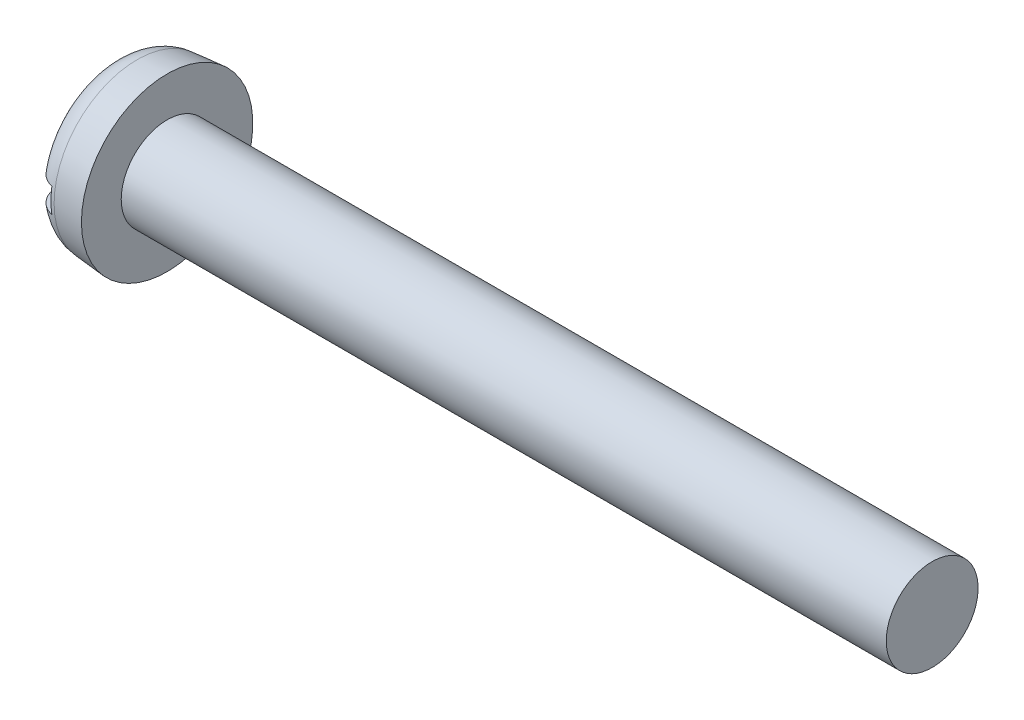
ISO-10303-21;
HEADER;
FILE_DESCRIPTION(('STEP AP214'),'2;1');
FILE_NAME('part.step','',(''),(''),'','','');
FILE_SCHEMA(('AUTOMOTIVE_DESIGN { 1 0 10303 214 1 1 1 1 }'));
ENDSEC;
DATA;
#1=APPLICATION_CONTEXT('core data for automotive mechanical design processes');
#2=APPLICATION_PROTOCOL_DEFINITION('international standard','automotive_design',2000,#1);
#3=PRODUCT_CONTEXT('',#1,'mechanical');
#4=PRODUCT('Part','Part','',(#3));
#5=PRODUCT_RELATED_PRODUCT_CATEGORY('part','',(#4));
#6=PRODUCT_DEFINITION_FORMATION('','',#4);
#7=PRODUCT_DEFINITION_CONTEXT('part definition',#1,'design');
#8=PRODUCT_DEFINITION('design','',#6,#7);
#9=PRODUCT_DEFINITION_SHAPE('','',#8);
#10=(LENGTH_UNIT() NAMED_UNIT(*) SI_UNIT(.MILLI.,.METRE.));
#11=(NAMED_UNIT(*) PLANE_ANGLE_UNIT() SI_UNIT($,.RADIAN.));
#12=(NAMED_UNIT(*) SI_UNIT($,.STERADIAN.) SOLID_ANGLE_UNIT());
#13=UNCERTAINTY_MEASURE_WITH_UNIT(LENGTH_MEASURE(1.E-05),#10,'distance_accuracy_value','');
#14=(GEOMETRIC_REPRESENTATION_CONTEXT(3) GLOBAL_UNCERTAINTY_ASSIGNED_CONTEXT((#13)) GLOBAL_UNIT_ASSIGNED_CONTEXT((#10,
#11,#12)) REPRESENTATION_CONTEXT('',''));
#15=CARTESIAN_POINT('',(0.,0.,0.));
#16=DIRECTION('',(0.,0.,1.));
#17=DIRECTION('',(1.,0.,0.));
#18=AXIS2_PLACEMENT_3D('',#15,#16,#17);
#19=CARTESIAN_POINT('',(0.,0.,0.));
#20=DIRECTION('',(-1.,0.,0.));
#21=DIRECTION('',(0.,0.,1.));
#22=AXIS2_PLACEMENT_3D('',#19,#20,#21);
#23=PLANE('',#22);
#24=DIRECTION('',(0.,0.,-1.));
#25=VECTOR('',#24,1.);
#26=CARTESIAN_POINT('',(0.,0.4,2.8));
#27=LINE('',#26,#25);
#28=CARTESIAN_POINT('',(0.,0.4,1.77326763142532));
#29=VERTEX_POINT('',#28);
#30=CARTESIAN_POINT('',(0.,0.4,-1.77326763142532));
#31=VERTEX_POINT('',#30);
#32=EDGE_CURVE('E88',#29,#31,#27,.T.);
#33=ORIENTED_EDGE('',*,*,#32,.F.);
#34=CARTESIAN_POINT('',(0.,0.,0.));
#35=DIRECTION('',(-1.,0.,0.));
#36=DIRECTION('',(0.,0.,1.));
#37=AXIS2_PLACEMENT_3D('',#34,#35,#36);
#38=CIRCLE('',#37,1.81782234903766);
#39=EDGE_CURVE('E94',#29,#31,#38,.T.);
#40=ORIENTED_EDGE('',*,*,#39,.T.);
#41=EDGE_LOOP('',(#33,#40));
#42=FACE_BOUND('',#41,.T.);
#43=ADVANCED_FACE('F35',(#42),#23,.T.);
#44=CARTESIAN_POINT('',(-25.4,0.,0.));
#45=DIRECTION('',(-1.,0.,0.));
#46=DIRECTION('',(0.,0.,1.));
#47=AXIS2_PLACEMENT_3D('',#44,#45,#46);
#48=CYLINDRICAL_SURFACE('',#47,1.5);
#49=CARTESIAN_POINT('',(26.8,0.,0.));
#50=DIRECTION('',(-1.,0.,0.));
#51=DIRECTION('',(0.,0.,1.));
#52=AXIS2_PLACEMENT_3D('',#49,#50,#51);
#53=CIRCLE('',#52,1.5);
#54=CARTESIAN_POINT('',(26.8,0.,1.5));
#55=VERTEX_POINT('',#54);
#56=EDGE_CURVE('E95',#55,#55,#53,.T.);
#57=ORIENTED_EDGE('',*,*,#56,.T.);
#58=EDGE_LOOP('',(#57));
#59=FACE_BOUND('',#58,.T.);
#60=CARTESIAN_POINT('',(1.8,0.,0.));
#61=DIRECTION('',(-1.,0.,0.));
#62=DIRECTION('',(0.,0.,1.));
#63=AXIS2_PLACEMENT_3D('',#60,#61,#62);
#64=CIRCLE('',#63,1.5);
#65=CARTESIAN_POINT('',(1.8,0.,1.5));
#66=VERTEX_POINT('',#65);
#67=EDGE_CURVE('E152',#66,#66,#64,.T.);
#68=ORIENTED_EDGE('',*,*,#67,.F.);
#69=EDGE_LOOP('',(#68));
#70=FACE_BOUND('',#69,.T.);
#71=ADVANCED_FACE('F140',(#59,#70),#48,.T.);
#72=CARTESIAN_POINT('',(26.8,1.5,0.));
#73=DIRECTION('',(1.,0.,0.));
#74=DIRECTION('',(0.,0.,-1.));
#75=AXIS2_PLACEMENT_3D('',#72,#73,#74);
#76=PLANE('',#75);
#77=ORIENTED_EDGE('',*,*,#56,.F.);
#78=EDGE_LOOP('',(#77));
#79=FACE_BOUND('',#78,.T.);
#80=ADVANCED_FACE('F138',(#79),#76,.T.);
#81=DIRECTION('',(0.,0.,1.));
#82=VECTOR('',#81,1.);
#83=CARTESIAN_POINT('',(0.,-0.4,-2.8));
#84=LINE('',#83,#82);
#85=CARTESIAN_POINT('',(0.,-0.4,-1.77326763142532));
#86=VERTEX_POINT('',#85);
#87=CARTESIAN_POINT('',(0.,-0.4,1.77326763142532));
#88=VERTEX_POINT('',#87);
#89=EDGE_CURVE('E79',#86,#88,#84,.T.);
#90=ORIENTED_EDGE('',*,*,#89,.F.);
#91=EDGE_CURVE('E86',#86,#88,#38,.T.);
#92=ORIENTED_EDGE('',*,*,#91,.T.);
#93=EDGE_LOOP('',(#90,#92));
#94=FACE_BOUND('',#93,.T.);
#95=ADVANCED_FACE('F85',(#94),#23,.T.);
#96=CARTESIAN_POINT('',(0.,0.,0.));
#97=DIRECTION('',(1.,0.,0.));
#98=DIRECTION('',(0.,0.,-1.));
#99=AXIS2_PLACEMENT_3D('',#96,#97,#98);
#100=CONICAL_SURFACE('',#99,2.64252040565334,0.0872664625997168);
#101=CARTESIAN_POINT('',(0.821559831527111,0.,0.));
#102=DIRECTION('',(-1.,0.,0.));
#103=DIRECTION('',(0.,0.,1.));
#104=AXIS2_PLACEMENT_3D('',#101,#102,#103);
#105=CIRCLE('',#104,2.71439757732023);
#106=CARTESIAN_POINT('',(0.821559831527111,0.,2.71439757732023));
#107=VERTEX_POINT('',#106);
#108=EDGE_CURVE('E98',#107,#107,#105,.F.);
#109=ORIENTED_EDGE('',*,*,#108,.T.);
#110=EDGE_LOOP('',(#109));
#111=FACE_BOUND('',#110,.T.);
#112=CARTESIAN_POINT('',(1.8,0.,0.));
#113=DIRECTION('',(-1.,0.,0.));
#114=DIRECTION('',(0.,0.,1.));
#115=AXIS2_PLACEMENT_3D('',#112,#113,#114);
#116=CIRCLE('',#115,2.8);
#117=CARTESIAN_POINT('',(1.8,0.,2.8));
#118=VERTEX_POINT('',#117);
#119=EDGE_CURVE('E100',#118,#118,#116,.T.);
#120=ORIENTED_EDGE('',*,*,#119,.T.);
#121=EDGE_LOOP('',(#120));
#122=FACE_BOUND('',#121,.T.);
#123=ADVANCED_FACE('F131',(#111,#122),#100,.T.);
#124=CARTESIAN_POINT('',(1.8,1.5,0.));
#125=DIRECTION('',(-1.,0.,0.));
#126=DIRECTION('',(0.,0.,1.));
#127=AXIS2_PLACEMENT_3D('',#124,#125,#126);
#128=PLANE('',#127);
#129=ORIENTED_EDGE('',*,*,#119,.F.);
#130=EDGE_LOOP('',(#129));
#131=FACE_BOUND('',#130,.T.);
#132=ORIENTED_EDGE('',*,*,#67,.T.);
#133=EDGE_LOOP('',(#132));
#134=FACE_BOUND('',#133,.T.);
#135=ADVANCED_FACE('F127',(#131,#134),#128,.F.);
#136=CARTESIAN_POINT('',(0.9,0.,0.));
#137=DIRECTION('',(-1.,0.,0.));
#138=DIRECTION('',(0.,0.,1.));
#139=AXIS2_PLACEMENT_3D('',#136,#137,#138);
#140=TOROIDAL_SURFACE('',#139,1.81782234903766,0.9);
#141=CARTESIAN_POINT('',(0.285780762477817,0.4,-2.44311963508101));
#142=CARTESIAN_POINT('',(0.322325244969282,0.4,-2.47769297217772));
#143=CARTESIAN_POINT('',(0.361794878156767,0.4,-2.50922544126929));
#144=CARTESIAN_POINT('',(0.445493757535043,0.4,-2.56525291577746));
#145=CARTESIAN_POINT('',(0.48972822484029,0.4,-2.58974009118149));
#146=CARTESIAN_POINT('',(0.581685294636184,0.4,-2.63091846199156));
#147=CARTESIAN_POINT('',(0.629407305379898,0.4,-2.64761097641683));
#148=CARTESIAN_POINT('',(0.726972312257169,0.4,-2.67270033258514));
#149=CARTESIAN_POINT('',(0.776814803129367,0.4,-2.68109913910669));
#150=CARTESIAN_POINT('',(0.876977038697279,0.4,-2.68933922206438));
#151=CARTESIAN_POINT('',(0.92729364560996,0.4,-2.68921866149007));
#152=CARTESIAN_POINT('',(1.02719093347253,0.4,-2.68051830929739));
#153=CARTESIAN_POINT('',(1.07677160162593,0.4,-2.67193837076201));
#154=CARTESIAN_POINT('',(1.17371760664879,0.4,-2.6465919807109));
#155=CARTESIAN_POINT('',(1.2210859954371,0.4,-2.62983719558013));
#156=CARTESIAN_POINT('',(1.31235127069059,0.4,-2.58864040768255));
#157=CARTESIAN_POINT('',(1.35624813968071,0.4,-2.56419836622246));
#158=CARTESIAN_POINT('',(1.43950339303332,0.4,-2.50824069345436));
#159=CARTESIAN_POINT('',(1.47884484993389,0.4,-2.47669988555644));
#160=CARTESIAN_POINT('',(1.55173067508121,0.4,-2.40751412200212));
#161=CARTESIAN_POINT('',(1.5852748745774,0.4,-2.36986898871862));
#162=CARTESIAN_POINT('',(1.64594872274809,0.4,-2.28919528368316));
#163=CARTESIAN_POINT('',(1.67301846569636,0.4,-2.24612167422176));
#164=CARTESIAN_POINT('',(1.71966197411636,0.4,-2.15609376898817));
#165=CARTESIAN_POINT('',(1.73923530584546,0.4,-2.10913924885738));
#166=CARTESIAN_POINT('',(1.77066025907209,0.4,-2.01194193646076));
#167=CARTESIAN_POINT('',(1.78239254664628,0.4,-1.96166058810882));
#168=CARTESIAN_POINT('',(1.7974373595853,0.4,-1.85985639013623));
#169=CARTESIAN_POINT('',(1.80074908437145,0.4,-1.80833342293966));
#170=CARTESIAN_POINT('',(1.79894832980293,0.4,-1.70434405475568));
#171=CARTESIAN_POINT('',(1.79365584590562,0.4,-1.651880798299));
#172=CARTESIAN_POINT('',(1.77456092354076,0.4,-1.54852841034414));
#173=CARTESIAN_POINT('',(1.76075741543224,0.4,-1.49763947754675));
#174=CARTESIAN_POINT('',(1.7246504916629,0.4,-1.3975266769579));
#175=CARTESIAN_POINT('',(1.70214283236717,0.4,-1.34837644263265));
#176=CARTESIAN_POINT('',(1.64933120824444,0.4,-1.25444995564252));
#177=CARTESIAN_POINT('',(1.6190255468442,0.4,-1.20967465773975));
#178=CARTESIAN_POINT('',(1.55085214424215,0.4,-1.12504927254803));
#179=CARTESIAN_POINT('',(1.51286662510254,0.4,-1.08529386793689));
#180=CARTESIAN_POINT('',(1.4306134165613,0.4,-1.01288372669284));
#181=CARTESIAN_POINT('',(1.38634513970435,0.4,-0.98022965477811));
#182=CARTESIAN_POINT('',(1.29378824575784,0.4,-0.924048107397016));
#183=CARTESIAN_POINT('',(1.24562231583718,0.4,-0.900319541839471));
#184=CARTESIAN_POINT('',(1.14574424072186,0.4,-0.862177327128565));
#185=CARTESIAN_POINT('',(1.09403573066562,0.4,-0.847754283110134));
#186=CARTESIAN_POINT('',(0.993395643106033,0.4,-0.830011922353258));
#187=CARTESIAN_POINT('',(0.944615271160061,0.4,-0.825833796085956));
#188=CARTESIAN_POINT('',(0.847107354416665,0.4,-0.826334878356685));
#189=CARTESIAN_POINT('',(0.798379798268946,0.4,-0.831011470142969));
#190=CARTESIAN_POINT('',(0.705495670608722,0.4,-0.848340731069384));
#191=CARTESIAN_POINT('',(0.661242330843084,0.4,-0.860484898174224));
#192=CARTESIAN_POINT('',(0.575232402842407,0.4,-0.891650416332973));
#193=CARTESIAN_POINT('',(0.53347652813922,0.4,-0.910673721938904));
#194=CARTESIAN_POINT('',(0.451191926076944,0.4,-0.956010770911779));
#195=CARTESIAN_POINT('',(0.41084895856706,0.4,-0.982660648611481));
#196=CARTESIAN_POINT('',(0.334722321142851,0.4,-1.04182188589593));
#197=CARTESIAN_POINT('',(0.298940164912517,0.4,-1.0743351828853));
#198=CARTESIAN_POINT('',(0.229649980616187,0.4,-1.14749226888793));
#199=CARTESIAN_POINT('',(0.196634914830279,0.4,-1.18860403936715));
#200=CARTESIAN_POINT('',(0.137645150810002,0.4,-1.27560624817727));
#201=CARTESIAN_POINT('',(0.111672172806045,0.4,-1.32149785033543));
#202=CARTESIAN_POINT('',(0.0665593590158842,0.4,-1.41881690272049));
#203=CARTESIAN_POINT('',(0.0477401615322292,0.4,-1.47039354331754));
#204=CARTESIAN_POINT('',(0.0191028447664946,0.4,-1.57598967955257));
#205=CARTESIAN_POINT('',(0.00928429911433809,0.4,-1.63000905934828));
#206=CARTESIAN_POINT('',(-0.000908845669418395,0.4,-1.73850050809585));
#207=CARTESIAN_POINT('',(-0.00135843890630447,0.4,-1.7929654882335));
#208=CARTESIAN_POINT('',(0.0071379486879365,0.4,-1.90117587148683));
#209=CARTESIAN_POINT('',(0.0160852351491476,0.4,-1.9549211735574));
#210=CARTESIAN_POINT('',(0.0428869469078852,0.4,-2.05874477252473));
#211=CARTESIAN_POINT('',(0.0605196216319731,0.4,-2.10888044427302));
#212=CARTESIAN_POINT('',(0.104140493725079,0.4,-2.20532358851202));
#213=CARTESIAN_POINT('',(0.130117020588857,0.4,-2.25163629510255));
#214=CARTESIAN_POINT('',(0.178150945787742,0.4,-2.32211375046635));
#215=CARTESIAN_POINT('',(0.197843641859489,0.4,-2.34792122195273));
#216=CARTESIAN_POINT('',(0.239879292580621,0.4,-2.39728022756983));
#217=CARTESIAN_POINT('',(0.26222221206527,0.4,-2.42083179162577));
#218=CARTESIAN_POINT('',(0.285780762477817,0.4,-2.44311963508101));
#219=B_SPLINE_CURVE_WITH_KNOTS('',3,(#141,#142,#143,#144,#145,#146,#147,#148,#149,#150,#151,
#152,#153,#154,#155,#156,#157,#158,#159,#160,#161,#162,#163,#164,#165,#166,#167,#168,#169,#170,
#171,#172,#173,#174,#175,#176,#177,#178,#179,#180,#181,#182,#183,#184,#185,#186,#187,#188,#189,
#190,#191,#192,#193,#194,#195,#196,#197,#198,#199,#200,#201,#202,#203,#204,#205,#206,#207,#208,
#209,#210,#211,#212,#213,#214,#215,#216,#217,#218),.UNSPECIFIED.,.T.,.F.,(4,2,2,2,2,2,2,2,2,2,2,
2,2,2,2,2,2,2,2,2,2,2,2,2,2,2,2,2,2,2,2,2,2,2,2,2,2,2,4),(0.,0.150804282209429,
0.301775523831159,0.452721208703323,0.603631125974155,0.753865076726384,0.904101636690626,
1.05412441728995,1.2041479530309,1.35471219197995,1.50528081291864,1.65719291262943,
1.80911380065295,1.96329712022902,2.11749509812026,2.27496068670365,2.43244606914274,
2.59387611122166,2.75534130458713,2.9195015653164,3.08367718561128,3.24389389244898,
3.40394859014677,3.55004213794101,3.69609251881817,3.83315592967566,3.97025831464732,
4.11470991133513,4.25920932580005,4.41668805635775,4.57420522099046,4.73812462607052,
4.90203626571949,5.06463536051201,5.22725705028985,5.38592661841767,5.54437521558828,
5.64159310397338,5.73880970255809),.UNSPECIFIED.);
#220=CARTESIAN_POINT('',(0.7,0.4,-2.66547244738019));
#221=VERTEX_POINT('',#220);
#222=EDGE_CURVE('E11',#31,#221,#219,.T.);
#223=ORIENTED_EDGE('',*,*,#222,.F.);
#224=ORIENTED_EDGE('',*,*,#39,.F.);
#225=CARTESIAN_POINT('',(0.356169071138295,0.4,1.02545886384317));
#226=CARTESIAN_POINT('',(0.394477383289829,0.4,0.994276095963573));
#227=CARTESIAN_POINT('',(0.435252098816795,0.4,0.966090537778846));
#228=CARTESIAN_POINT('',(0.520874070068605,0.4,0.916713010685472));
#229=CARTESIAN_POINT('',(0.565722974989389,0.4,0.895523890103121));
#230=CARTESIAN_POINT('',(0.658585145836014,0.4,0.861072215462474));
#231=CARTESIAN_POINT('',(0.706609437889925,0.4,0.84783908573147));
#232=CARTESIAN_POINT('',(0.804243253507339,0.4,0.83024223356215));
#233=CARTESIAN_POINT('',(0.853851628876229,0.4,0.825872228699233));
#234=CARTESIAN_POINT('',(0.950010182321422,0.4,0.826277197704913));
#235=CARTESIAN_POINT('',(0.996563474122619,0.4,0.830513937244102));
#236=CARTESIAN_POINT('',(1.08828168676608,0.4,0.846797595491544));
#237=CARTESIAN_POINT('',(1.1334463088223,0.4,0.858846182848628));
#238=CARTESIAN_POINT('',(1.22099947575276,0.4,0.890027753500388));
#239=CARTESIAN_POINT('',(1.26339999097867,0.4,0.909127417221131));
#240=CARTESIAN_POINT('',(1.34475562295769,0.4,0.953613660794996));
#241=CARTESIAN_POINT('',(1.38370973618203,0.4,0.979002063689565));
#242=CARTESIAN_POINT('',(1.4606297229717,0.4,1.03768873851847));
#243=CARTESIAN_POINT('',(1.49821861120609,0.4,1.07148126912977));
#244=CARTESIAN_POINT('',(1.56766557552966,0.4,1.14451739265722));
#245=CARTESIAN_POINT('',(1.59952174981566,0.4,1.18376278691406));
#246=CARTESIAN_POINT('',(1.65882951195037,0.4,1.26965174466254));
#247=CARTESIAN_POINT('',(1.68580874421987,0.4,1.3166225459502));
#248=CARTESIAN_POINT('',(1.7316261790846,0.4,1.41438438512647));
#249=CARTESIAN_POINT('',(1.7504634598458,0.4,1.46517585482832));
#250=CARTESIAN_POINT('',(1.77959171793735,0.4,1.56990546726));
#251=CARTESIAN_POINT('',(1.78976336496765,0.4,1.62387693551388));
#252=CARTESIAN_POINT('',(1.80070617985939,0.4,1.73276786407042));
#253=CARTESIAN_POINT('',(1.80147810121521,0.4,1.78768724803349));
#254=CARTESIAN_POINT('',(1.7935515731225,0.4,1.89576039323533));
#255=CARTESIAN_POINT('',(1.78503812714098,0.4,1.94892767588158));
#256=CARTESIAN_POINT('',(1.75897009134329,0.4,2.05299963181348));
#257=CARTESIAN_POINT('',(1.74141670948687,0.4,2.10390460641263));
#258=CARTESIAN_POINT('',(1.69825810143573,0.4,2.20064023444731));
#259=CARTESIAN_POINT('',(1.67286703477487,0.4,2.24656646381803));
#260=CARTESIAN_POINT('',(1.61458416704904,0.4,2.33338474929434));
#261=CARTESIAN_POINT('',(1.58169323312494,0.4,2.37427738654701));
#262=CARTESIAN_POINT('',(1.51007060998367,0.4,2.44900649357427));
#263=CARTESIAN_POINT('',(1.47146964140907,0.4,2.48296829636122));
#264=CARTESIAN_POINT('',(1.38904817001727,0.4,2.54382334084698));
#265=CARTESIAN_POINT('',(1.34522808158393,0.4,2.57071714318276));
#266=CARTESIAN_POINT('',(1.25424836231413,0.4,2.61630908807752));
#267=CARTESIAN_POINT('',(1.20714119293126,0.4,2.63511196373395));
#268=CARTESIAN_POINT('',(1.11042474691739,0.4,2.66447616047847));
#269=CARTESIAN_POINT('',(1.06081558875378,0.4,2.67503787139057));
#270=CARTESIAN_POINT('',(0.960893961973374,0.4,2.68755622717405));
#271=CARTESIAN_POINT('',(0.910589316471373,0.4,2.68957539390776));
#272=CARTESIAN_POINT('',(0.810358152757914,0.4,2.68512046084422));
#273=CARTESIAN_POINT('',(0.760431626986744,0.4,2.67864653130185));
#274=CARTESIAN_POINT('',(0.662478823238217,0.4,2.65741995217084));
#275=CARTESIAN_POINT('',(0.614448868329621,0.4,2.64268425826029));
#276=CARTESIAN_POINT('',(0.521534433162197,0.4,2.60538142887937));
#277=CARTESIAN_POINT('',(0.476649962619439,0.4,2.58281426921971));
#278=CARTESIAN_POINT('',(0.391148993047609,0.4,2.53043182461717));
#279=CARTESIAN_POINT('',(0.350545548527357,0.4,2.50059523892845));
#280=CARTESIAN_POINT('',(0.274874117650141,0.4,2.43457977439371));
#281=CARTESIAN_POINT('',(0.239806285839746,0.4,2.39840071853429));
#282=CARTESIAN_POINT('',(0.175879279186199,0.4,2.32042102737606));
#283=CARTESIAN_POINT('',(0.147073507775005,0.4,2.27857662814835));
#284=CARTESIAN_POINT('',(0.0967847753411474,0.4,2.19069995841567));
#285=CARTESIAN_POINT('',(0.07530224160311,0.4,2.14466744374764));
#286=CARTESIAN_POINT('',(0.0399276675747797,0.4,2.04903409979779));
#287=CARTESIAN_POINT('',(0.0261471165350434,0.4,1.99939205575588));
#288=CARTESIAN_POINT('',(0.00693602242391574,0.4,1.89852251200784));
#289=CARTESIAN_POINT('',(0.00150590448368233,0.4,1.84729493171548));
#290=CARTESIAN_POINT('',(-0.000985777473937043,0.4,1.74359522844075));
#291=CARTESIAN_POINT('',(0.00212519999965263,0.4,1.69111899279254));
#292=CARTESIAN_POINT('',(0.0168916821616578,0.4,1.58737297380086));
#293=CARTESIAN_POINT('',(0.0285499964789277,0.4,1.53610359288829));
#294=CARTESIAN_POINT('',(0.0604020950384818,0.4,1.43486374575567));
#295=CARTESIAN_POINT('',(0.0808043159051547,0.4,1.38495893538538));
#296=CARTESIAN_POINT('',(0.129530825890043,0.4,1.28921347783136));
#297=CARTESIAN_POINT('',(0.157849403934622,0.4,1.24336993202389));
#298=CARTESIAN_POINT('',(0.213684916145749,0.4,1.16773658539622));
#299=CARTESIAN_POINT('',(0.239651023875377,0.4,1.13678903007943));
#300=CARTESIAN_POINT('',(0.29525297901351,0.4,1.07838116842152));
#301=CARTESIAN_POINT('',(0.324888803246328,0.4,1.05092084005941));
#302=CARTESIAN_POINT('',(0.356169071138295,0.4,1.02545886384317));
#303=B_SPLINE_CURVE_WITH_KNOTS('',3,(#225,#226,#227,#228,#229,#230,#231,#232,#233,#234,#235,
#236,#237,#238,#239,#240,#241,#242,#243,#244,#245,#246,#247,#248,#249,#250,#251,#252,#253,#254,
#255,#256,#257,#258,#259,#260,#261,#262,#263,#264,#265,#266,#267,#268,#269,#270,#271,#272,#273,
#274,#275,#276,#277,#278,#279,#280,#281,#282,#283,#284,#285,#286,#287,#288,#289,#290,#291,#292,
#293,#294,#295,#296,#297,#298,#299,#300,#301,#302),.UNSPECIFIED.,.T.,.F.,(4,2,2,2,2,2,2,2,2,2,2,
2,2,2,2,2,2,2,2,2,2,2,2,2,2,2,2,2,2,2,2,2,2,2,2,2,2,2,4),(0.,0.148056677712979,
0.296173556814866,0.444834912477076,0.593390856036848,0.732942639414739,0.87252424155987,
1.01145452751666,1.15042513517956,1.30141738715291,1.45245963818336,1.61420969223844,
1.7759780548859,1.93993961693164,2.10388803551639,2.26462860972824,2.42534771058163,
2.5820147845557,2.73866375372932,2.89216335268838,3.04565077231286,3.19708679229202,
3.34851564860216,3.49883427697698,3.64914989207022,3.79915813668078,3.94916684463061,
4.09962050651671,4.25007836811616,4.40177296660437,4.55347641441351,4.70732244078731,
4.86117629939849,5.0181609530014,5.17519723279955,5.33620557401864,5.49709805791682,
5.61799301592463,5.73888721047272),.UNSPECIFIED.);
#304=CARTESIAN_POINT('',(0.7,0.4,2.66547244738019));
#305=VERTEX_POINT('',#304);
#306=EDGE_CURVE('E112',#305,#29,#303,.T.);
#307=ORIENTED_EDGE('',*,*,#306,.F.);
#308=CARTESIAN_POINT('',(0.7,0.,0.));
#309=DIRECTION('',(-1.,0.,0.));
#310=DIRECTION('',(0.,0.,1.));
#311=AXIS2_PLACEMENT_3D('',#308,#309,#310);
#312=CIRCLE('',#311,2.69531878777687);
#313=CARTESIAN_POINT('',(0.7,-0.4,2.66547244738019));
#314=VERTEX_POINT('',#313);
#315=EDGE_CURVE('E106',#305,#314,#312,.F.);
#316=ORIENTED_EDGE('',*,*,#315,.T.);
#317=CARTESIAN_POINT('',(0.356169071138295,-0.4,1.02545886384317));
#318=CARTESIAN_POINT('',(0.314031332279046,-0.4,1.05976167261355));
#319=CARTESIAN_POINT('',(0.274819372687131,-0.4,1.0977427449374));
#320=CARTESIAN_POINT('',(0.20326819432942,-0.4,1.17978565669674));
#321=CARTESIAN_POINT('',(0.170942545508555,-0.4,1.22385922524595));
#322=CARTESIAN_POINT('',(0.114111407238762,-0.4,1.31672727393884));
#323=CARTESIAN_POINT('',(0.0895968760226377,-0.4,1.36551620987613));
#324=CARTESIAN_POINT('',(0.0490785202121341,-0.4,1.46648183341045));
#325=CARTESIAN_POINT('',(0.0330703604686472,-0.4,1.51865678013273));
#326=CARTESIAN_POINT('',(0.0100453697545741,-0.4,1.62518908376032));
#327=CARTESIAN_POINT('',(0.00306618218707067,-0.4,1.67955460937645));
#328=CARTESIAN_POINT('',(-0.00144685561490171,-0.4,1.78868546318226));
#329=CARTESIAN_POINT('',(0.00101939609011308,-0.4,1.84345079568049));
#330=CARTESIAN_POINT('',(0.0152891480749748,-0.4,1.95052330416009));
#331=CARTESIAN_POINT('',(0.0268854930795697,-0.4,2.0028580557661));
#332=CARTESIAN_POINT('',(0.0589248901673074,-0.4,2.10474672243029));
#333=CARTESIAN_POINT('',(0.0793666318053631,-0.4,2.15430104818042));
#334=CARTESIAN_POINT('',(0.12795627217374,-0.4,2.24792186385266));
#335=CARTESIAN_POINT('',(0.155901237504733,-0.4,2.29209371256844));
#336=CARTESIAN_POINT('',(0.218944857951455,-0.4,2.37499861286517));
#337=CARTESIAN_POINT('',(0.254042725445853,-0.4,2.41373226246544));
#338=CARTESIAN_POINT('',(0.32966685096813,-0.4,2.48389534278566));
#339=CARTESIAN_POINT('',(0.370077637452011,-0.4,2.51544927894014));
#340=CARTESIAN_POINT('',(0.455677448683675,-0.4,2.57122459505542));
#341=CARTESIAN_POINT('',(0.50086612816506,-0.4,2.59544650436481));
#342=CARTESIAN_POINT('',(0.59413782417454,-0.4,2.6355729416184));
#343=CARTESIAN_POINT('',(0.642178527071037,-0.4,2.65157587103637));
#344=CARTESIAN_POINT('',(0.740273420359946,-0.4,2.67523109383666));
#345=CARTESIAN_POINT('',(0.790327524333045,-0.4,2.68288374523438));
#346=CARTESIAN_POINT('',(0.890686133385993,-0.4,2.68958762962226));
#347=CARTESIAN_POINT('',(0.940986998851126,-0.4,2.68869347246838));
#348=CARTESIAN_POINT('',(1.04072178380744,-0.4,2.67846167879018));
#349=CARTESIAN_POINT('',(1.0901557170213,-0.4,2.66912417603886));
#350=CARTESIAN_POINT('',(1.18669599164727,-0.4,2.64229877559468));
#351=CARTESIAN_POINT('',(1.23380501833184,-0.4,2.6248205362643));
#352=CARTESIAN_POINT('',(1.32443528846507,-0.4,2.58223220159563));
#353=CARTESIAN_POINT('',(1.36795650500275,-0.4,2.5571220490195));
#354=CARTESIAN_POINT('',(1.45036421793263,-0.4,2.49989362614525));
#355=CARTESIAN_POINT('',(1.48923230512215,-0.4,2.46774885590998));
#356=CARTESIAN_POINT('',(1.56107927302393,-0.4,2.39744378923729));
#357=CARTESIAN_POINT('',(1.59405796507024,-0.4,2.35928330016087));
#358=CARTESIAN_POINT('',(1.65352847250663,-0.4,2.2776666814067));
#359=CARTESIAN_POINT('',(1.67995797143492,-0.4,2.23416516156708));
#360=CARTESIAN_POINT('',(1.72526137908633,-0.4,2.14339421504175));
#361=CARTESIAN_POINT('',(1.74413484906926,-0.4,2.09612456975119));
#362=CARTESIAN_POINT('',(1.77411508290512,-0.4,1.9983989612356));
#363=CARTESIAN_POINT('',(1.78509960932637,-0.4,1.9479055243096));
#364=CARTESIAN_POINT('',(1.79862667184961,-0.4,1.84580292273346));
#365=CARTESIAN_POINT('',(1.80116838107033,-0.4,1.79419364929756));
#366=CARTESIAN_POINT('',(1.79780993826834,-0.4,1.69014314952536));
#367=CARTESIAN_POINT('',(1.79172746900389,-0.4,1.63770783465182));
#368=CARTESIAN_POINT('',(1.77106806778027,-0.4,1.53454005861514));
#369=CARTESIAN_POINT('',(1.75649007103968,-0.4,1.48380781174802));
#370=CARTESIAN_POINT('',(1.7188487103298,-0.4,1.38413781596447));
#371=CARTESIAN_POINT('',(1.69558194660123,-0.4,1.33527684770509));
#372=CARTESIAN_POINT('',(1.64130257902653,-0.4,1.24205401456033));
#373=CARTESIAN_POINT('',(1.6102882125599,-0.4,1.19769317671197));
#374=CARTESIAN_POINT('',(1.54078360718032,-0.4,1.11407031283595));
#375=CARTESIAN_POINT('',(1.50218355419827,-0.4,1.07489936013486));
#376=CARTESIAN_POINT('',(1.41879382359701,-0.4,1.00377929202409));
#377=CARTESIAN_POINT('',(1.37400377230517,-0.4,0.971830612909673));
#378=CARTESIAN_POINT('',(1.28066227969846,-0.4,0.917245549760186));
#379=CARTESIAN_POINT('',(1.23224470963451,-0.4,0.894381439836964));
#380=CARTESIAN_POINT('',(1.13202516716603,-0.4,0.858023892867302));
#381=CARTESIAN_POINT('',(1.08022692076976,-0.4,0.844520323748755));
#382=CARTESIAN_POINT('',(0.979686768939646,-0.4,0.828554710074538));
#383=CARTESIAN_POINT('',(0.931083582720591,-0.4,0.82521631591368));
#384=CARTESIAN_POINT('',(0.834057576527118,-0.4,0.827306267768065));
#385=CARTESIAN_POINT('',(0.785634764475608,-0.4,0.832734994430688));
#386=CARTESIAN_POINT('',(0.693219129123408,-0.4,0.851440182721389));
#387=CARTESIAN_POINT('',(0.6491307615266,-0.4,0.864254528165209));
#388=CARTESIAN_POINT('',(0.563580966367806,-0.4,0.896690334746237));
#389=CARTESIAN_POINT('',(0.522117110679347,-0.4,0.916305391888431));
#390=CARTESIAN_POINT('',(0.460201335026829,-0.4,0.951554535089635));
#391=CARTESIAN_POINT('',(0.438547037771904,-0.4,0.965129512636782));
#392=CARTESIAN_POINT('',(0.396436028831446,-0.4,0.994018383793284));
#393=CARTESIAN_POINT('',(0.375979221006585,-0.4,1.00933213751562));
#394=CARTESIAN_POINT('',(0.356169071138295,-0.4,1.02545886384317));
#395=B_SPLINE_CURVE_WITH_KNOTS('',3,(#317,#318,#319,#320,#321,#322,#323,#324,#325,#326,#327,
#328,#329,#330,#331,#332,#333,#334,#335,#336,#337,#338,#339,#340,#341,#342,#343,#344,#345,#346,
#347,#348,#349,#350,#351,#352,#353,#354,#355,#356,#357,#358,#359,#360,#361,#362,#363,#364,#365,
#366,#367,#368,#369,#370,#371,#372,#373,#374,#375,#376,#377,#378,#379,#380,#381,#382,#383,#384,
#385,#386,#387,#388,#389,#390,#391,#392,#393,#394),.UNSPECIFIED.,.T.,.F.,(4,2,2,2,2,2,2,2,2,2,2,
2,2,2,2,2,2,2,2,2,2,2,2,2,2,2,2,2,2,2,2,2,2,2,2,2,2,2,4),(0.,0.162908543977832,
0.326135200101453,0.489172220791498,0.652126072139755,0.815757140806174,0.979389975458609,
1.13941349616251,1.29941331750199,1.45545894016543,1.61148738958683,1.76455910424509,
1.91761976498379,2.068802492645,2.21997873814259,2.37018969158947,2.52039826519579,
2.67042907998157,2.82046101999671,2.97106818075077,3.12168016531919,3.27367450756494,
3.42567767407005,3.5799880622519,3.73431356299688,3.89195060675763,4.04960741210517,
4.2112132976058,4.37285598283535,4.5370386362033,4.70123120514444,4.86099956435944,
5.02059471531597,5.16597452097208,5.31136063884072,5.44850857150574,5.58552770590542,
5.66212180496716,5.73870974628516),.UNSPECIFIED.);
#396=EDGE_CURVE('E93',#88,#314,#395,.T.);
#397=ORIENTED_EDGE('',*,*,#396,.F.);
#398=ORIENTED_EDGE('',*,*,#91,.F.);
#399=CARTESIAN_POINT('',(0.285780762477817,-0.4,-2.44311963508101));
#400=CARTESIAN_POINT('',(0.248557143829482,-0.4,-2.4078972812164));
#401=CARTESIAN_POINT('',(0.21431245236119,-0.4,-2.3694650707352));
#402=CARTESIAN_POINT('',(0.152768043532584,-0.4,-2.28733938194963));
#403=CARTESIAN_POINT('',(0.125478130377416,-0.4,-2.24363860286105));
#404=CARTESIAN_POINT('',(0.0786257158649476,-0.4,-2.15234079857027));
#405=CARTESIAN_POINT('',(0.0590537929026404,-0.4,-2.10474861000723));
#406=CARTESIAN_POINT('',(0.0280650821156157,-0.4,-2.00700047851119));
#407=CARTESIAN_POINT('',(0.0166461813020745,-0.4,-1.95684520345737));
#408=CARTESIAN_POINT('',(0.00206923204411924,-0.4,-1.85464080389292));
#409=CARTESIAN_POINT('',(-0.000972085111053216,-0.4,-1.80257506295451));
#410=CARTESIAN_POINT('',(0.00151453147792929,-0.4,-1.69864852440772));
#411=CARTESIAN_POINT('',(0.00704382880236595,-0.4,-1.64678776072725));
#412=CARTESIAN_POINT('',(0.0266516864050342,-0.4,-1.5434240201059));
#413=CARTESIAN_POINT('',(0.0409314131746844,-0.4,-1.49195921679783));
#414=CARTESIAN_POINT('',(0.0777275151672627,-0.4,-1.39206285915813));
#415=CARTESIAN_POINT('',(0.100245079836245,-0.4,-1.34363174403842));
#416=CARTESIAN_POINT('',(0.153482972183088,-0.4,-1.2500005252344));
#417=CARTESIAN_POINT('',(0.184382352554496,-0.4,-1.20490211419648));
#418=CARTESIAN_POINT('',(0.253306595403157,-0.4,-1.12049761259773));
#419=CARTESIAN_POINT('',(0.291333458753369,-0.4,-1.08119315410127));
#420=CARTESIAN_POINT('',(0.373599819825438,-0.4,-1.00962170698056));
#421=CARTESIAN_POINT('',(0.417845144124488,-0.4,-0.977361391817105));
#422=CARTESIAN_POINT('',(0.511393224424661,-0.4,-0.921257408160295));
#423=CARTESIAN_POINT('',(0.560693424544353,-0.4,-0.897409512943095));
#424=CARTESIAN_POINT('',(0.659899494014213,-0.4,-0.86056620148907));
#425=CARTESIAN_POINT('',(0.70959665550847,-0.4,-0.847011806093055));
#426=CARTESIAN_POINT('',(0.81063175641273,-0.4,-0.829407026781007));
#427=CARTESIAN_POINT('',(0.861968199741098,-0.4,-0.825348214635538));
#428=CARTESIAN_POINT('',(0.959752077480286,-0.4,-0.82693832731787));
#429=CARTESIAN_POINT('',(1.00621575887746,-0.4,-0.831730406017744));
#430=CARTESIAN_POINT('',(1.09766854953413,-0.4,-0.849077179323799));
#431=CARTESIAN_POINT('',(1.14265739171951,-0.4,-0.861633271803835));
#432=CARTESIAN_POINT('',(1.2299114176728,-0.4,-0.893807868219966));
#433=CARTESIAN_POINT('',(1.27218175788193,-0.4,-0.913412506998421));
#434=CARTESIAN_POINT('',(1.35320643219735,-0.4,-0.958874855551496));
#435=CARTESIAN_POINT('',(1.39195973961517,-0.4,-0.984734383223624));
#436=CARTESIAN_POINT('',(1.46843970297676,-0.4,-1.04440221898529));
#437=CARTESIAN_POINT('',(1.5057776319984,-0.4,-1.07870901508261));
#438=CARTESIAN_POINT('',(1.57463408911242,-0.4,-1.15273784634507));
#439=CARTESIAN_POINT('',(1.60615068897795,-0.4,-1.19246166827117));
#440=CARTESIAN_POINT('',(1.66460952025841,-0.4,-1.27921419766999));
#441=CARTESIAN_POINT('',(1.69108592858502,-0.4,-1.32655784594953));
#442=CARTESIAN_POINT('',(1.73582713929311,-0.4,-1.42498260596115));
#443=CARTESIAN_POINT('',(1.75409110005355,-0.4,-1.47606410012852));
#444=CARTESIAN_POINT('',(1.7819800651308,-0.4,-1.58118959955467));
#445=CARTESIAN_POINT('',(1.79150042969761,-0.4,-1.63526148025197));
#446=CARTESIAN_POINT('',(1.80112725488866,-0.4,-1.74424014808114));
#447=CARTESIAN_POINT('',(1.80123449731023,-0.4,-1.79914686549765));
#448=CARTESIAN_POINT('',(1.79200090917881,-0.4,-1.90704889801334));
#449=CARTESIAN_POINT('',(1.78285023172313,-0.4,-1.96006044029451));
#450=CARTESIAN_POINT('',(1.75554489311913,-0.4,-2.06371351442585));
#451=CARTESIAN_POINT('',(1.73739144905737,-0.4,-2.11435536562275));
#452=CARTESIAN_POINT('',(1.69310212999213,-0.4,-2.21047686976185));
#453=CARTESIAN_POINT('',(1.66717834059447,-0.4,-2.25605427430112));
#454=CARTESIAN_POINT('',(1.60789945686383,-0.4,-2.34209023989538));
#455=CARTESIAN_POINT('',(1.57454519739076,-0.4,-2.38254937521993));
#456=CARTESIAN_POINT('',(1.50207992140168,-0.4,-2.45635864078367));
#457=CARTESIAN_POINT('',(1.46309647311969,-0.4,-2.48983406282631));
#458=CARTESIAN_POINT('',(1.37999946341266,-0.4,-2.54966020191344));
#459=CARTESIAN_POINT('',(1.33588629200968,-0.4,-2.57601146011503));
#460=CARTESIAN_POINT('',(1.24441048294309,-0.4,-2.6204920842224));
#461=CARTESIAN_POINT('',(1.19709806498187,-0.4,-2.63872477396665));
#462=CARTESIAN_POINT('',(1.10007286159794,-0.4,-2.66692299241135));
#463=CARTESIAN_POINT('',(1.05036028930681,-0.4,-2.67688925373976));
#464=CARTESIAN_POINT('',(0.950330778412724,-0.4,-2.68821568147498));
#465=CARTESIAN_POINT('',(0.900020830724849,-0.4,-2.68963769422185));
#466=CARTESIAN_POINT('',(0.799864722777445,-0.4,-2.68399705480249));
#467=CARTESIAN_POINT('',(0.750018680334321,-0.4,-2.67693230351107));
#468=CARTESIAN_POINT('',(0.652295079642407,-0.4,-2.6545442288954));
#469=CARTESIAN_POINT('',(0.604414938079601,-0.4,-2.63923214293824));
#470=CARTESIAN_POINT('',(0.511939743577346,-0.4,-2.60081753553039));
#471=CARTESIAN_POINT('',(0.467340561615687,-0.4,-2.5777250172516));
#472=CARTESIAN_POINT('',(0.400101785238431,-0.4,-2.53543999984867));
#473=CARTESIAN_POINT('',(0.375979970292489,-0.4,-2.51855507086787));
#474=CARTESIAN_POINT('',(0.329505055171142,-0.4,-2.48250598020391));
#475=CARTESIAN_POINT('',(0.307151944649364,-0.4,-2.46334183185513));
#476=CARTESIAN_POINT('',(0.285780762477817,-0.4,-2.44311963508101));
#477=B_SPLINE_CURVE_WITH_KNOTS('',3,(#399,#400,#401,#402,#403,#404,#405,#406,#407,#408,#409,
#410,#411,#412,#413,#414,#415,#416,#417,#418,#419,#420,#421,#422,#423,#424,#425,#426,#427,#428,
#429,#430,#431,#432,#433,#434,#435,#436,#437,#438,#439,#440,#441,#442,#443,#444,#445,#446,#447,
#448,#449,#450,#451,#452,#453,#454,#455,#456,#457,#458,#459,#460,#461,#462,#463,#464,#465,#466,
#467,#468,#469,#470,#471,#472,#473,#474,#475,#476),.UNSPECIFIED.,.T.,.F.,(4,2,2,2,2,2,2,2,2,2,2,
2,2,2,2,2,2,2,2,2,2,2,2,2,2,2,2,2,2,2,2,2,2,2,2,2,2,2,4),(0.,0.153630076563003,0.30747554336492,
0.461132620212027,0.614749859849374,0.770496992161263,0.926268906303976,1.08576372212915,
1.24528157620828,1.40851960556979,1.57180352898442,1.73524147908282,1.89859719430262,
2.05228040591997,2.205827157294,2.34528036488284,2.48475868767391,2.62396413120245,
2.7632100815968,2.91467905032863,3.06619810123316,3.22817436288511,3.39016722026913,
3.55407439716564,3.71796796090444,3.87856222841603,4.03913479105936,4.19567175163465,
4.35219113316334,4.50560019509845,4.65899760068397,4.81038266514853,4.96175431138951,
5.1120289424741,5.26234075029904,5.41244826767269,5.56236352612232,5.65056762019062,
5.73877119825418),.UNSPECIFIED.);
#478=CARTESIAN_POINT('',(0.7,-0.4,-2.66547244738019));
#479=VERTEX_POINT('',#478);
#480=EDGE_CURVE('E47',#479,#86,#477,.T.);
#481=ORIENTED_EDGE('',*,*,#480,.F.);
#482=EDGE_CURVE('E59',#479,#221,#312,.F.);
#483=ORIENTED_EDGE('',*,*,#482,.T.);
#484=EDGE_LOOP('',(#223,#224,#307,#316,#397,#398,#481,#483));
#485=FACE_BOUND('',#484,.T.);
#486=ORIENTED_EDGE('',*,*,#108,.F.);
#487=EDGE_LOOP('',(#486));
#488=FACE_BOUND('',#487,.T.);
#489=ADVANCED_FACE('F37',(#485,#488),#140,.T.);
#490=CARTESIAN_POINT('',(0.7,0.4,2.8));
#491=DIRECTION('',(0.,1.,0.));
#492=DIRECTION('',(0.,0.,1.));
#493=AXIS2_PLACEMENT_3D('',#490,#491,#492);
#494=PLANE('',#493);
#495=ORIENTED_EDGE('',*,*,#222,.T.);
#496=DIRECTION('',(0.,0.,-1.));
#497=VECTOR('',#496,1.);
#498=CARTESIAN_POINT('',(0.7,0.4,2.8));
#499=LINE('',#498,#497);
#500=EDGE_CURVE('E87',#305,#221,#499,.T.);
#501=ORIENTED_EDGE('',*,*,#500,.F.);
#502=ORIENTED_EDGE('',*,*,#306,.T.);
#503=ORIENTED_EDGE('',*,*,#32,.T.);
#504=EDGE_LOOP('',(#495,#501,#502,#503));
#505=FACE_BOUND('',#504,.T.);
#506=ADVANCED_FACE('F119',(#505),#494,.F.);
#507=CARTESIAN_POINT('',(0.7,-0.4,-2.8));
#508=DIRECTION('',(0.,-1.,0.));
#509=DIRECTION('',(0.,0.,-1.));
#510=AXIS2_PLACEMENT_3D('',#507,#508,#509);
#511=PLANE('',#510);
#512=ORIENTED_EDGE('',*,*,#480,.T.);
#513=ORIENTED_EDGE('',*,*,#89,.T.);
#514=ORIENTED_EDGE('',*,*,#396,.T.);
#515=DIRECTION('',(0.,0.,1.));
#516=VECTOR('',#515,1.);
#517=CARTESIAN_POINT('',(0.7,-0.4,-2.8));
#518=LINE('',#517,#516);
#519=EDGE_CURVE('E54',#479,#314,#518,.T.);
#520=ORIENTED_EDGE('',*,*,#519,.F.);
#521=EDGE_LOOP('',(#512,#513,#514,#520));
#522=FACE_BOUND('',#521,.T.);
#523=ADVANCED_FACE('F78',(#522),#511,.F.);
#524=CARTESIAN_POINT('',(0.7,0.4,-2.8));
#525=DIRECTION('',(-1.,0.,0.));
#526=DIRECTION('',(0.,0.,1.));
#527=AXIS2_PLACEMENT_3D('',#524,#525,#526);
#528=PLANE('',#527);
#529=ORIENTED_EDGE('',*,*,#519,.T.);
#530=ORIENTED_EDGE('',*,*,#315,.F.);
#531=ORIENTED_EDGE('',*,*,#500,.T.);
#532=ORIENTED_EDGE('',*,*,#482,.F.);
#533=EDGE_LOOP('',(#529,#530,#531,#532));
#534=FACE_BOUND('',#533,.T.);
#535=ADVANCED_FACE('F118',(#534),#528,.T.);
#536=CLOSED_SHELL('',(#43,#71,#80,#95,#123,#135,#489,#506,#523,#535));
#537=MANIFOLD_SOLID_BREP('B2',#536);
#538=ADVANCED_BREP_SHAPE_REPRESENTATION('',(#18,#537),#14);
#539=SHAPE_DEFINITION_REPRESENTATION(#9,#538);
ENDSEC;
END-ISO-10303-21;
